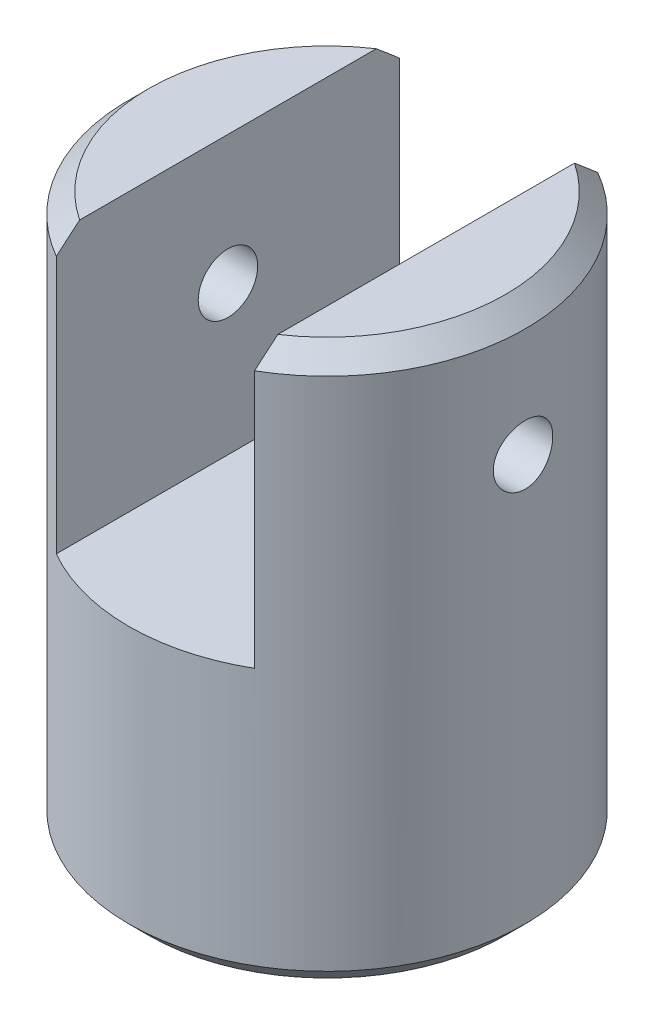
ISO-10303-21;
HEADER;
FILE_DESCRIPTION(('STEP AP214'),'2;1');
FILE_NAME('part.step','',(''),(''),'','','');
FILE_SCHEMA(('AUTOMOTIVE_DESIGN { 1 0 10303 214 1 1 1 1 }'));
ENDSEC;
DATA;
#1=APPLICATION_CONTEXT('core data for automotive mechanical design processes');
#2=APPLICATION_PROTOCOL_DEFINITION('international standard','automotive_design',2000,#1);
#3=PRODUCT_CONTEXT('',#1,'mechanical');
#4=PRODUCT('Part','Part','',(#3));
#5=PRODUCT_RELATED_PRODUCT_CATEGORY('part','',(#4));
#6=PRODUCT_DEFINITION_FORMATION('','',#4);
#7=PRODUCT_DEFINITION_CONTEXT('part definition',#1,'design');
#8=PRODUCT_DEFINITION('design','',#6,#7);
#9=PRODUCT_DEFINITION_SHAPE('','',#8);
#10=(LENGTH_UNIT() NAMED_UNIT(*) SI_UNIT(.MILLI.,.METRE.));
#11=(NAMED_UNIT(*) PLANE_ANGLE_UNIT() SI_UNIT($,.RADIAN.));
#12=(NAMED_UNIT(*) SI_UNIT($,.STERADIAN.) SOLID_ANGLE_UNIT());
#13=UNCERTAINTY_MEASURE_WITH_UNIT(LENGTH_MEASURE(1.E-05),#10,'distance_accuracy_value','');
#14=(GEOMETRIC_REPRESENTATION_CONTEXT(3) GLOBAL_UNCERTAINTY_ASSIGNED_CONTEXT((#13)) GLOBAL_UNIT_ASSIGNED_CONTEXT((#10,
#11,#12)) REPRESENTATION_CONTEXT('',''));
#15=CARTESIAN_POINT('',(0.,0.,0.));
#16=DIRECTION('',(0.,0.,1.));
#17=DIRECTION('',(1.,0.,0.));
#18=AXIS2_PLACEMENT_3D('',#15,#16,#17);
#19=CARTESIAN_POINT('',(0.,14.,0.));
#20=DIRECTION('',(0.,-1.,0.));
#21=DIRECTION('',(0.,0.,-1.));
#22=AXIS2_PLACEMENT_3D('',#19,#20,#21);
#23=CYLINDRICAL_SURFACE('',#22,5.);
#24=CARTESIAN_POINT('',(-4.9434299833213,10.75,-0.750000000000001));
#25=CARTESIAN_POINT('',(-4.94343068334296,10.708127215355,-0.749998270536421));
#26=CARTESIAN_POINT('',(-4.9439677586955,10.6662301246246,-0.746481481942455));
#27=CARTESIAN_POINT('',(-4.9460565740162,10.5836073425584,-0.732510983285004));
#28=CARTESIAN_POINT('',(-4.94760930365715,10.54288283426,-0.722050507013141));
#29=CARTESIAN_POINT('',(-4.95154969493114,10.4638131222765,-0.69451263049042));
#30=CARTESIAN_POINT('',(-4.95393671565768,10.4254661187289,-0.677440308406985));
#31=CARTESIAN_POINT('',(-4.95927597056573,10.352186484614,-0.637175315438957));
#32=CARTESIAN_POINT('',(-4.96222812691834,10.3172533848929,-0.61398348714936));
#33=CARTESIAN_POINT('',(-4.9683914462402,10.2515080916228,-0.561939512092793));
#34=CARTESIAN_POINT('',(-4.97160431229029,10.2207271932966,-0.533048027924102));
#35=CARTESIAN_POINT('',(-4.97791184084524,10.1644312571723,-0.470509802722188));
#36=CARTESIAN_POINT('',(-4.98100649684307,10.1389165089165,-0.436862800393266));
#37=CARTESIAN_POINT('',(-4.98674673714093,10.0937616841543,-0.365568179026373));
#38=CARTESIAN_POINT('',(-4.98939009217784,10.0741504248388,-0.327902113682884));
#39=CARTESIAN_POINT('',(-4.99391103373202,10.0415442005959,-0.249764425053488));
#40=CARTESIAN_POINT('',(-4.99578866070972,10.0285488860786,-0.209292950135339));
#41=CARTESIAN_POINT('',(-4.99855457398891,10.0096383057346,-0.127015561545285));
#42=CARTESIAN_POINT('',(-4.99945017943672,10.0036706368064,-0.0852219421949333));
#43=CARTESIAN_POINT('',(-5.00017622384792,9.99882203258755,-0.00121760200973985));
#44=CARTESIAN_POINT('',(-5.0000067220247,9.99994070334016,0.0409930955078728));
#45=CARTESIAN_POINT('',(-4.99862749830398,10.0091916688812,0.124275859100259));
#46=CARTESIAN_POINT('',(-4.99742613826239,10.0172675858957,0.165354345700003));
#47=CARTESIAN_POINT('',(-4.99412750113925,10.0401153031613,0.245566414571568));
#48=CARTESIAN_POINT('',(-4.99203020099869,10.0548872757507,0.28469994675674));
#49=CARTESIAN_POINT('',(-4.98716096936603,10.0907654984585,0.360081890385158));
#50=CARTESIAN_POINT('',(-4.98438651757819,10.1118954825544,0.396318836161798));
#51=CARTESIAN_POINT('',(-4.97847219122711,10.159872596835,0.464753953575088));
#52=CARTESIAN_POINT('',(-4.97533229261592,10.1867201033534,0.496951859135867));
#53=CARTESIAN_POINT('',(-4.96900079096313,10.2456842244133,0.556727241361322));
#54=CARTESIAN_POINT('',(-4.96580898311628,10.2778500609851,0.584256164754733));
#55=CARTESIAN_POINT('',(-4.95976352226762,10.3463705385619,0.633532996694064));
#56=CARTESIAN_POINT('',(-4.95690987134824,10.38272520536,0.655280869639994));
#57=CARTESIAN_POINT('',(-4.95186387643428,10.4586419814703,0.692384822673024));
#58=CARTESIAN_POINT('',(-4.94967204922646,10.4982065668312,0.707735911350408));
#59=CARTESIAN_POINT('',(-4.9462070144953,10.5793926275737,0.731561681044396));
#60=CARTESIAN_POINT('',(-4.9449337422315,10.6210139577734,0.74003684668663));
#61=CARTESIAN_POINT('',(-4.94346225697513,10.7047000447887,0.749803600433278));
#62=CARTESIAN_POINT('',(-4.94325374401287,10.7467565941008,0.751164016325262));
#63=CARTESIAN_POINT('',(-4.94390803968577,10.8304970974087,0.746845285099096));
#64=CARTESIAN_POINT('',(-4.94477081507889,10.8721810629254,0.741166356411512));
#65=CARTESIAN_POINT('',(-4.94746101230727,10.9537799089828,0.722988514763831));
#66=CARTESIAN_POINT('',(-4.94928358241429,10.9937026024708,0.710523892639104));
#67=CARTESIAN_POINT('',(-4.95368400912884,11.0708920460243,0.679164159735433));
#68=CARTESIAN_POINT('',(-4.95626190303588,11.1081586648141,0.660268731381946));
#69=CARTESIAN_POINT('',(-4.96190677843531,11.1792866301675,0.616418389976619));
#70=CARTESIAN_POINT('',(-4.96497729639994,11.2131202236399,0.591418922808832));
#71=CARTESIAN_POINT('',(-4.97125079716678,11.2761364299369,0.536132084186008));
#72=CARTESIAN_POINT('',(-4.97445378745146,11.3053187795906,0.505844413723399));
#73=CARTESIAN_POINT('',(-4.98066352608693,11.3584513033168,0.440537809814093));
#74=CARTESIAN_POINT('',(-4.98366841730212,11.3823558641212,0.40548156338598));
#75=CARTESIAN_POINT('',(-4.98911452516008,11.4239364526313,0.331811040131841));
#76=CARTESIAN_POINT('',(-4.99155575722282,11.4416126507325,0.29319686068022));
#77=CARTESIAN_POINT('',(-4.99559134830398,11.470161871244,0.213648997930574));
#78=CARTESIAN_POINT('',(-4.9971888085895,11.4810598335392,0.172724429377152));
#79=CARTESIAN_POINT('',(-4.99936988328448,11.4958239397687,0.0896004077505968));
#80=CARTESIAN_POINT('',(-4.99995356465401,11.4996905481246,0.0474010390652906));
#81=CARTESIAN_POINT('',(-5.00004064529571,11.5002708522747,-0.0366322954304091));
#82=CARTESIAN_POINT('',(-4.99955458511898,11.4970543404385,-0.0784657851060259));
#83=CARTESIAN_POINT('',(-4.99757805259571,11.4837093057896,-0.160989897661553));
#84=CARTESIAN_POINT('',(-4.99608758346333,11.4735808050957,-0.201680524198256));
#85=CARTESIAN_POINT('',(-4.99226893371232,11.4467240622149,-0.28074468718983));
#86=CARTESIAN_POINT('',(-4.98994136658473,11.4300006524305,-0.319119896574391));
#87=CARTESIAN_POINT('',(-4.9847041724775,11.3904362560084,-0.392530558948301));
#88=CARTESIAN_POINT('',(-4.98179452660169,11.3675950707598,-0.427565903460355));
#89=CARTESIAN_POINT('',(-4.97568255318089,11.3161911505854,-0.493656292595979));
#90=CARTESIAN_POINT('',(-4.97247774212971,11.2875768870918,-0.524671033223191));
#91=CARTESIAN_POINT('',(-4.96615500844501,11.2255474634598,-0.581484041951338));
#92=CARTESIAN_POINT('',(-4.96303710638146,11.1921311780878,-0.607281083994919));
#93=CARTESIAN_POINT('',(-4.95722242014558,11.1212255083837,-0.653056554114872));
#94=CARTESIAN_POINT('',(-4.95452810078493,11.0837142914891,-0.673001471456045));
#95=CARTESIAN_POINT('',(-4.94989454555362,11.0058516116184,-0.706278069360226));
#96=CARTESIAN_POINT('',(-4.94795452653966,10.9655031460711,-0.719616612874488));
#97=CARTESIAN_POINT('',(-4.94549742762413,10.8958112818718,-0.736274759450132));
#98=CARTESIAN_POINT('',(-4.9447262469119,10.8668983015379,-0.741413848902101));
#99=CARTESIAN_POINT('',(-4.94369228283506,10.8086608541328,-0.748277052882871));
#100=CARTESIAN_POINT('',(-4.94342949288078,10.7793363924002,-0.750001211675379));
#101=CARTESIAN_POINT('',(-4.9434299833213,10.75,-0.750000000000001));
#102=B_SPLINE_CURVE_WITH_KNOTS('',3,(#24,#25,#26,#27,#28,#29,#30,#31,#32,#33,#34,#35,#36,#37,
#38,#39,#40,#41,#42,#43,#44,#45,#46,#47,#48,#49,#50,#51,#52,#53,#54,#55,#56,#57,#58,#59,#60,#61,
#62,#63,#64,#65,#66,#67,#68,#69,#70,#71,#72,#73,#74,#75,#76,#77,#78,#79,#80,#81,#82,#83,#84,#85,
#86,#87,#88,#89,#90,#91,#92,#93,#94,#95,#96,#97,#98,#99,#100,#101),.UNSPECIFIED.,.T.,.F.,(4,2,2,
2,2,2,2,2,2,2,2,2,2,2,2,2,2,2,2,2,2,2,2,2,2,2,2,2,2,2,2,2,2,2,2,2,2,2,4),(0.,0.125511125902433,
0.2511447347809,0.376682042667836,0.502202074330662,0.628620793245537,0.755046461039085,
0.88207961052891,1.0091060468225,1.13517916267198,1.26124526969687,1.38629931257864,
1.51135657419701,1.63688658193227,1.76242485474636,1.88919772333135,2.01597137257175,
2.14284375886569,2.26970720222171,2.39534107301872,2.52097104549959,2.64597197403687,
2.77097907643058,2.89692743000651,3.02288290730901,3.14988768876758,3.27688899535927,
3.40342020445545,3.52994305585237,3.65522481811163,3.78050617946411,3.90569591128917,
4.03088970783553,4.15725475005485,4.28364945118431,4.41075439412466,4.53772701722782,
4.62566220945807,4.71359626188096),.UNSPECIFIED.);
#103=CARTESIAN_POINT('',(-4.9434299833213,10.75,-0.750000000000001));
#104=VERTEX_POINT('',#103);
#105=EDGE_CURVE('E203',#104,#104,#102,.T.);
#106=ORIENTED_EDGE('',*,*,#105,.F.);
#107=EDGE_LOOP('',(#106));
#108=FACE_BOUND('',#107,.T.);
#109=CARTESIAN_POINT('',(0.,0.499999999999999,0.));
#110=DIRECTION('',(0.,1.,0.));
#111=DIRECTION('',(0.,0.,1.));
#112=AXIS2_PLACEMENT_3D('',#109,#110,#111);
#113=CIRCLE('',#112,5.);
#114=CARTESIAN_POINT('',(0.,0.499999999999999,5.));
#115=VERTEX_POINT('',#114);
#116=EDGE_CURVE('E114',#115,#115,#113,.T.);
#117=ORIENTED_EDGE('',*,*,#116,.T.);
#118=EDGE_LOOP('',(#117));
#119=FACE_BOUND('',#118,.T.);
#120=CARTESIAN_POINT('',(0.,13.5,0.));
#121=DIRECTION('',(0.,1.,0.));
#122=DIRECTION('',(0.,0.,1.));
#123=AXIS2_PLACEMENT_3D('',#120,#121,#122);
#124=CIRCLE('',#123,5.);
#125=CARTESIAN_POINT('',(2.5,13.5,-4.33012701892219));
#126=VERTEX_POINT('',#125);
#127=CARTESIAN_POINT('',(2.5,13.4999999999999,4.33012701892231));
#128=VERTEX_POINT('',#127);
#129=EDGE_CURVE('E161',#126,#128,#124,.F.);
#130=ORIENTED_EDGE('',*,*,#129,.T.);
#131=DIRECTION('',(0.,-1.,0.));
#132=VECTOR('',#131,1.);
#133=CARTESIAN_POINT('',(2.5,14.,4.33012701892219));
#134=LINE('',#133,#132);
#135=CARTESIAN_POINT('',(2.5,7.,4.33012701892219));
#136=VERTEX_POINT('',#135);
#137=EDGE_CURVE('E63',#128,#136,#134,.T.);
#138=ORIENTED_EDGE('',*,*,#137,.T.);
#139=CARTESIAN_POINT('',(0.,7.,0.));
#140=DIRECTION('',(0.,-1.,0.));
#141=DIRECTION('',(0.,0.,-1.));
#142=AXIS2_PLACEMENT_3D('',#139,#140,#141);
#143=CIRCLE('',#142,5.);
#144=CARTESIAN_POINT('',(-2.5,7.,4.3301270189222));
#145=VERTEX_POINT('',#144);
#146=EDGE_CURVE('E176',#136,#145,#143,.T.);
#147=ORIENTED_EDGE('',*,*,#146,.T.);
#148=DIRECTION('',(0.,-1.,0.));
#149=VECTOR('',#148,1.);
#150=CARTESIAN_POINT('',(-2.5,14.,4.3301270189222));
#151=LINE('',#150,#149);
#152=CARTESIAN_POINT('',(-2.5,13.5,4.3301270189222));
#153=VERTEX_POINT('',#152);
#154=EDGE_CURVE('E173',#145,#153,#151,.F.);
#155=ORIENTED_EDGE('',*,*,#154,.T.);
#156=CARTESIAN_POINT('',(-2.5,13.4999999999999,-4.33012701892231));
#157=VERTEX_POINT('',#156);
#158=EDGE_CURVE('E160',#153,#157,#124,.F.);
#159=ORIENTED_EDGE('',*,*,#158,.T.);
#160=DIRECTION('',(0.,-1.,0.));
#161=VECTOR('',#160,1.);
#162=CARTESIAN_POINT('',(-2.5,14.,-4.33012701892219));
#163=LINE('',#162,#161);
#164=CARTESIAN_POINT('',(-2.5,7.,-4.33012701892219));
#165=VERTEX_POINT('',#164);
#166=EDGE_CURVE('E96',#157,#165,#163,.T.);
#167=ORIENTED_EDGE('',*,*,#166,.T.);
#168=CARTESIAN_POINT('',(2.5,7.,-4.33012701892219));
#169=VERTEX_POINT('',#168);
#170=EDGE_CURVE('E120',#165,#169,#143,.T.);
#171=ORIENTED_EDGE('',*,*,#170,.T.);
#172=DIRECTION('',(0.,-1.,0.));
#173=VECTOR('',#172,1.);
#174=CARTESIAN_POINT('',(2.5,14.,-4.33012701892219));
#175=LINE('',#174,#173);
#176=EDGE_CURVE('E169',#169,#126,#175,.F.);
#177=ORIENTED_EDGE('',*,*,#176,.T.);
#178=EDGE_LOOP('',(#130,#138,#147,#155,#159,#167,#171,#177));
#179=FACE_BOUND('',#178,.T.);
#180=CARTESIAN_POINT('',(4.9434299833213,10.75,0.75));
#181=CARTESIAN_POINT('',(4.94343068334296,10.791872784645,0.749998270536421));
#182=CARTESIAN_POINT('',(4.9439677586955,10.8337698753754,0.746481481942454));
#183=CARTESIAN_POINT('',(4.9460565740162,10.9163926574416,0.732510983285004));
#184=CARTESIAN_POINT('',(4.94760930365715,10.95711716574,0.722050507013141));
#185=CARTESIAN_POINT('',(4.95154969493114,11.0361868777235,0.69451263049042));
#186=CARTESIAN_POINT('',(4.95393671565768,11.0745338812711,0.677440308406985));
#187=CARTESIAN_POINT('',(4.95927597056573,11.147813515386,0.637175315438957));
#188=CARTESIAN_POINT('',(4.96222812691834,11.1827466151071,0.613983487149359));
#189=CARTESIAN_POINT('',(4.9683914462402,11.2484919083772,0.561939512092793));
#190=CARTESIAN_POINT('',(4.97160431229029,11.2792728067034,0.533048027924102));
#191=CARTESIAN_POINT('',(4.97791184084524,11.3355687428278,0.470509802722188));
#192=CARTESIAN_POINT('',(4.98100649684307,11.3610834910835,0.436862800393266));
#193=CARTESIAN_POINT('',(4.98674673714093,11.4062383158457,0.365568179026373));
#194=CARTESIAN_POINT('',(4.98939009217784,11.4258495751612,0.327902113682884));
#195=CARTESIAN_POINT('',(4.99391103373202,11.4584557994041,0.249764425053488));
#196=CARTESIAN_POINT('',(4.99578866070972,11.4714511139214,0.209292950135339));
#197=CARTESIAN_POINT('',(4.99855457398891,11.4903616942654,0.127015561545285));
#198=CARTESIAN_POINT('',(4.99945017943672,11.4963293631936,0.0852219421949331));
#199=CARTESIAN_POINT('',(5.00017622384792,11.5011779674124,0.00121760200973962));
#200=CARTESIAN_POINT('',(5.0000067220247,11.5000592966598,-0.040993095507873));
#201=CARTESIAN_POINT('',(4.99862749830398,11.4908083311188,-0.12427585910026));
#202=CARTESIAN_POINT('',(4.99742613826239,11.4827324141043,-0.165354345700004));
#203=CARTESIAN_POINT('',(4.99412750113925,11.4598846968387,-0.245566414571568));
#204=CARTESIAN_POINT('',(4.99203020099869,11.4451127242493,-0.28469994675674));
#205=CARTESIAN_POINT('',(4.98716096936603,11.4092345015415,-0.360081890385158));
#206=CARTESIAN_POINT('',(4.98438651757819,11.3881045174456,-0.396318836161798));
#207=CARTESIAN_POINT('',(4.97847219122711,11.340127403165,-0.464753953575088));
#208=CARTESIAN_POINT('',(4.97533229261592,11.3132798966466,-0.496951859135867));
#209=CARTESIAN_POINT('',(4.96900079096313,11.2543157755867,-0.556727241361323));
#210=CARTESIAN_POINT('',(4.96580898311628,11.2221499390149,-0.584256164754733));
#211=CARTESIAN_POINT('',(4.95976352226762,11.1536294614381,-0.633532996694064));
#212=CARTESIAN_POINT('',(4.95690987134824,11.11727479464,-0.655280869639995));
#213=CARTESIAN_POINT('',(4.95186387643428,11.0413580185297,-0.692384822673024));
#214=CARTESIAN_POINT('',(4.94967204922646,11.0017934331688,-0.707735911350408));
#215=CARTESIAN_POINT('',(4.9462070144953,10.9206073724263,-0.731561681044396));
#216=CARTESIAN_POINT('',(4.9449337422315,10.8789860422266,-0.74003684668663));
#217=CARTESIAN_POINT('',(4.94346225697513,10.7952999552113,-0.749803600433278));
#218=CARTESIAN_POINT('',(4.94325374401287,10.7532434058992,-0.751164016325262));
#219=CARTESIAN_POINT('',(4.94390803968577,10.6695029025913,-0.746845285099096));
#220=CARTESIAN_POINT('',(4.94477081507889,10.6278189370746,-0.741166356411512));
#221=CARTESIAN_POINT('',(4.94746101230727,10.5462200910172,-0.722988514763831));
#222=CARTESIAN_POINT('',(4.94928358241429,10.5062973975292,-0.710523892639104));
#223=CARTESIAN_POINT('',(4.95368400912884,10.4291079539757,-0.679164159735434));
#224=CARTESIAN_POINT('',(4.95626190303588,10.3918413351859,-0.660268731381946));
#225=CARTESIAN_POINT('',(4.96190677843531,10.3207133698325,-0.616418389976619));
#226=CARTESIAN_POINT('',(4.96497729639994,10.2868797763601,-0.591418922808832));
#227=CARTESIAN_POINT('',(4.97125079716678,10.2238635700631,-0.536132084186009));
#228=CARTESIAN_POINT('',(4.97445378745146,10.1946812204094,-0.505844413723399));
#229=CARTESIAN_POINT('',(4.98066352608693,10.1415486966832,-0.440537809814094));
#230=CARTESIAN_POINT('',(4.98366841730212,10.1176441358788,-0.40548156338598));
#231=CARTESIAN_POINT('',(4.98911452516008,10.0760635473687,-0.331811040131842));
#232=CARTESIAN_POINT('',(4.99155575722282,10.0583873492675,-0.293196860680221));
#233=CARTESIAN_POINT('',(4.99559134830398,10.029838128756,-0.213648997930575));
#234=CARTESIAN_POINT('',(4.9971888085895,10.0189401664608,-0.172724429377152));
#235=CARTESIAN_POINT('',(4.99936988328448,10.0041760602313,-0.0896004077505977));
#236=CARTESIAN_POINT('',(4.99995356465401,10.0003094518754,-0.0474010390652915));
#237=CARTESIAN_POINT('',(5.00004064529571,9.9997291477253,0.0366322954304083));
#238=CARTESIAN_POINT('',(4.99955458511898,10.0029456595615,0.0784657851060251));
#239=CARTESIAN_POINT('',(4.99757805259571,10.0162906942104,0.160989897661553));
#240=CARTESIAN_POINT('',(4.99608758346333,10.0264191949043,0.201680524198256));
#241=CARTESIAN_POINT('',(4.99226893371232,10.0532759377851,0.28074468718983));
#242=CARTESIAN_POINT('',(4.98994136658473,10.0699993475695,0.319119896574391));
#243=CARTESIAN_POINT('',(4.9847041724775,10.1095637439916,0.392530558948301));
#244=CARTESIAN_POINT('',(4.98179452660169,10.1324049292402,0.427565903460354));
#245=CARTESIAN_POINT('',(4.97568255318089,10.1838088494146,0.493656292595979));
#246=CARTESIAN_POINT('',(4.97247774212971,10.2124231129082,0.524671033223191));
#247=CARTESIAN_POINT('',(4.96615500844501,10.2744525365402,0.581484041951339));
#248=CARTESIAN_POINT('',(4.96303710638146,10.3078688219122,0.607281083994919));
#249=CARTESIAN_POINT('',(4.95722242014558,10.3787744916163,0.653056554114872));
#250=CARTESIAN_POINT('',(4.95452810078493,10.4162857085109,0.673001471456045));
#251=CARTESIAN_POINT('',(4.94989454555362,10.4941483883817,0.706278069360226));
#252=CARTESIAN_POINT('',(4.94795452653966,10.5344968539289,0.719616612874488));
#253=CARTESIAN_POINT('',(4.94549742762413,10.6041887181282,0.736274759450132));
#254=CARTESIAN_POINT('',(4.9447262469119,10.6331016984621,0.741413848902101));
#255=CARTESIAN_POINT('',(4.94369228283506,10.6913391458672,0.748277052882871));
#256=CARTESIAN_POINT('',(4.94342949288078,10.7206636075998,0.750001211675379));
#257=CARTESIAN_POINT('',(4.9434299833213,10.75,0.75));
#258=B_SPLINE_CURVE_WITH_KNOTS('',3,(#180,#181,#182,#183,#184,#185,#186,#187,#188,#189,#190,
#191,#192,#193,#194,#195,#196,#197,#198,#199,#200,#201,#202,#203,#204,#205,#206,#207,#208,#209,
#210,#211,#212,#213,#214,#215,#216,#217,#218,#219,#220,#221,#222,#223,#224,#225,#226,#227,#228,
#229,#230,#231,#232,#233,#234,#235,#236,#237,#238,#239,#240,#241,#242,#243,#244,#245,#246,#247,
#248,#249,#250,#251,#252,#253,#254,#255,#256,#257),.UNSPECIFIED.,.T.,.F.,(4,2,2,2,2,2,2,2,2,2,2,
2,2,2,2,2,2,2,2,2,2,2,2,2,2,2,2,2,2,2,2,2,2,2,2,2,2,2,4),(0.,0.125511125902433,0.2511447347809,
0.376682042667836,0.502202074330662,0.628620793245537,0.755046461039085,0.88207961052891,
1.0091060468225,1.13517916267198,1.26124526969687,1.38629931257864,1.51135657419701,
1.63688658193227,1.76242485474636,1.88919772333135,2.01597137257175,2.14284375886569,
2.26970720222171,2.39534107301872,2.52097104549959,2.64597197403687,2.77097907643058,
2.89692743000651,3.02288290730901,3.14988768876758,3.27688899535927,3.40342020445545,
3.52994305585237,3.65522481811163,3.78050617946412,3.90569591128917,4.03088970783553,
4.15725475005485,4.28364945118431,4.41075439412466,4.53772701722782,4.62566220945807,
4.71359626188096),.UNSPECIFIED.);
#259=CARTESIAN_POINT('',(4.9434299833213,10.75,0.75));
#260=VERTEX_POINT('',#259);
#261=EDGE_CURVE('E107',#260,#260,#258,.T.);
#262=ORIENTED_EDGE('',*,*,#261,.T.);
#263=EDGE_LOOP('',(#262));
#264=FACE_BOUND('',#263,.T.);
#265=ADVANCED_FACE('F35',(#108,#119,#179,#264),#23,.T.);
#266=CARTESIAN_POINT('',(2.5,7.,-5.));
#267=DIRECTION('',(1.,0.,0.));
#268=DIRECTION('',(0.,0.,-1.));
#269=AXIS2_PLACEMENT_3D('',#266,#267,#268);
#270=PLANE('',#269);
#271=CARTESIAN_POINT('',(2.5,7.49230468164976,10.7200445997966));
#272=CARTESIAN_POINT('',(2.5,7.75506756636977,10.4502132832323));
#273=CARTESIAN_POINT('',(2.5,8.01758510829374,10.1801421958178));
#274=CARTESIAN_POINT('',(2.5,8.54196313580733,9.63934488119114));
#275=CARTESIAN_POINT('',(2.5,8.80382359832416,9.36861863161152));
#276=CARTESIAN_POINT('',(2.5,9.32732256665294,8.82571139176574));
#277=CARTESIAN_POINT('',(2.5,9.5889590751083,8.55352847435077));
#278=CARTESIAN_POINT('',(2.5,10.1111100876743,8.00810209070006));
#279=CARTESIAN_POINT('',(2.5,10.3716246226112,7.73485865399944));
#280=CARTESIAN_POINT('',(2.5,10.9274271051678,7.1486869879645));
#281=CARTESIAN_POINT('',(2.5,11.2224905136658,6.83554566200725));
#282=CARTESIAN_POINT('',(2.5,11.8098036619689,6.20657096159051));
#283=CARTESIAN_POINT('',(2.5,12.1020531394998,5.89073734126856));
#284=CARTESIAN_POINT('',(2.5,12.5368245533138,5.41420501609597));
#285=CARTESIAN_POINT('',(2.5,12.6810236006092,5.25503739000377));
#286=CARTESIAN_POINT('',(2.5,12.9679780699096,4.93540730469388));
#287=CARTESIAN_POINT('',(2.5,13.1107335095992,4.77494486138156));
#288=CARTESIAN_POINT('',(2.5,13.3943352959092,4.45238307130351));
#289=CARTESIAN_POINT('',(2.5,13.5351819344881,4.29028398164157));
#290=CARTESIAN_POINT('',(2.5,13.8143346592327,3.96391676555558));
#291=CARTESIAN_POINT('',(2.5,13.9526408687089,3.79964874507863));
#292=CARTESIAN_POINT('',(2.5,14.1765463438924,3.52786693839434));
#293=CARTESIAN_POINT('',(2.5,14.2631917184952,3.42121588972721));
#294=CARTESIAN_POINT('',(2.5,14.434650967256,3.20643950812956));
#295=CARTESIAN_POINT('',(2.5,14.5194647583396,3.09831410868889));
#296=CARTESIAN_POINT('',(2.5,14.6869907632852,2.87992439432935));
#297=CARTESIAN_POINT('',(2.5,14.7696958944985,2.76965462746721));
#298=CARTESIAN_POINT('',(2.5,14.9319982014881,2.54685447802807));
#299=CARTESIAN_POINT('',(2.5,15.0115956601429,2.43432430262538));
#300=CARTESIAN_POINT('',(2.5,15.1645871568412,2.2094333924181));
#301=CARTESIAN_POINT('',(2.5,15.2380895732178,2.0971468571604));
#302=CARTESIAN_POINT('',(2.5,15.3797803212791,1.86915932082887));
#303=CARTESIAN_POINT('',(2.5,15.4479661145626,1.75345672467647));
#304=CARTESIAN_POINT('',(2.5,15.5766027847052,1.51851163818868));
#305=CARTESIAN_POINT('',(2.5,15.637089613119,1.39928906505602));
#306=CARTESIAN_POINT('',(2.5,15.7477122322526,1.15618552956646));
#307=CARTESIAN_POINT('',(2.5,15.7978619346617,1.03231109679894));
#308=CARTESIAN_POINT('',(2.5,15.8657113940024,0.833161623232762));
#309=CARTESIAN_POINT('',(2.5,15.888161956003,0.75950663533327));
#310=CARTESIAN_POINT('',(2.5,15.9274941305695,0.610683795946784));
#311=CARTESIAN_POINT('',(2.5,15.9443745255628,0.535515617499099));
#312=CARTESIAN_POINT('',(2.5,15.9717167247348,0.384336717463551));
#313=CARTESIAN_POINT('',(2.5,15.9822056590697,0.308330971298985));
#314=CARTESIAN_POINT('',(2.5,15.9963092567708,0.155686756839111));
#315=CARTESIAN_POINT('',(2.5,15.9999251105075,0.0790484004172064));
#316=CARTESIAN_POINT('',(2.5,16.0000728245547,-0.0744968895515405));
#317=CARTESIAN_POINT('',(2.5,15.99658048878,-0.151403847872895));
#318=CARTESIAN_POINT('',(2.5,15.9826702329363,-0.304582243916141));
#319=CARTESIAN_POINT('',(2.5,15.972251909262,-0.38085364433922));
#320=CARTESIAN_POINT('',(2.5,15.9450010489905,-0.532556249007512));
#321=CARTESIAN_POINT('',(2.5,15.9281417728176,-0.607982582825233));
#322=CARTESIAN_POINT('',(2.5,15.8887997060919,-0.757336293494587));
#323=CARTESIAN_POINT('',(2.5,15.8663164424582,-0.831263543679831));
#324=CARTESIAN_POINT('',(2.5,15.7874453384756,-1.06314705148186));
#325=CARTESIAN_POINT('',(2.5,15.7221939550254,-1.21808765790563));
#326=CARTESIAN_POINT('',(2.5,15.5767773878069,-1.52084061094836));
#327=CARTESIAN_POINT('',(2.5,15.4965833852095,-1.66863847619157));
#328=CARTESIAN_POINT('',(2.5,15.3686614858512,-1.88645685019238));
#329=CARTESIAN_POINT('',(2.5,15.324581172047,-1.95866246406654));
#330=CARTESIAN_POINT('',(2.5,15.2343633229119,-2.10178037140046));
#331=CARTESIAN_POINT('',(2.5,15.1882257419775,-2.17269263614136));
#332=CARTESIAN_POINT('',(2.5,15.0943114761419,-2.31331965029671));
#333=CARTESIAN_POINT('',(2.5,15.0465364113601,-2.38303548646622));
#334=CARTESIAN_POINT('',(2.5,14.9495871644524,-2.52148130605297));
#335=CARTESIAN_POINT('',(2.5,14.9004130325294,-2.59021132471161));
#336=CARTESIAN_POINT('',(2.5,14.7418086022003,-2.80794039877899));
#337=CARTESIAN_POINT('',(2.5,14.6301717804063,-2.95533231754791));
#338=CARTESIAN_POINT('',(2.5,14.4030119535972,-3.2470995775914));
#339=CARTESIAN_POINT('',(2.5,14.2874883395453,-3.39147444031171));
#340=CARTESIAN_POINT('',(2.5,14.0535706726081,-3.67798515912078));
#341=CARTESIAN_POINT('',(2.5,13.9351753161494,-3.82011994817957));
#342=CARTESIAN_POINT('',(2.5,13.6962779413685,-4.10261115079802));
#343=CARTESIAN_POINT('',(2.5,13.5757758471217,-4.24296749994891));
#344=CARTESIAN_POINT('',(2.5,13.3329591472947,-4.52251191771861));
#345=CARTESIAN_POINT('',(2.5,13.2106418550402,-4.66169764868645));
#346=CARTESIAN_POINT('',(2.5,12.9647399289612,-4.93894605483598));
#347=CARTESIAN_POINT('',(2.5,12.8411552809227,-5.07700871739071));
#348=CARTESIAN_POINT('',(2.5,12.4689754027014,-5.48976339446039));
#349=CARTESIAN_POINT('',(2.5,12.2188823489959,-5.76310419169612));
#350=CARTESIAN_POINT('',(2.5,11.7167631897699,-6.30658337970288));
#351=CARTESIAN_POINT('',(2.5,11.464744423164,-6.57672857694711));
#352=CARTESIAN_POINT('',(2.5,10.9588450798599,-7.11530352125393));
#353=CARTESIAN_POINT('',(2.5,10.7049643759338,-7.38373314869975));
#354=CARTESIAN_POINT('',(2.5,10.1960642778904,-7.91910575256703));
#355=CARTESIAN_POINT('',(2.5,9.94104594180954,-8.18604973593262));
#356=CARTESIAN_POINT('',(2.5,9.43000485919243,-8.71897466100184));
#357=CARTESIAN_POINT('',(2.5,9.17398211144013,-8.98495560153878));
#358=CARTESIAN_POINT('',(2.5,8.79910159811315,-9.37328370316923));
#359=CARTESIAN_POINT('',(2.5,8.68054798765262,-9.49592474663264));
#360=CARTESIAN_POINT('',(2.5,8.44327874422361,-9.74107771699721));
#361=CARTESIAN_POINT('',(2.5,8.32456309397788,-9.86358962717925));
#362=CARTESIAN_POINT('',(2.5,8.08698533845364,-10.1084993459394));
#363=CARTESIAN_POINT('',(2.5,7.96812321757388,-10.2308971393808));
#364=CARTESIAN_POINT('',(2.5,7.73029338471663,-10.475562124604));
#365=CARTESIAN_POINT('',(2.5,7.61132568679086,-10.5978293300444));
#366=CARTESIAN_POINT('',(2.5,7.49230468164976,-10.7200445997966));
#367=B_SPLINE_CURVE_WITH_KNOTS('',3,(#271,#272,#273,#274,#275,#276,#277,#278,#279,#280,#281,
#282,#283,#284,#285,#286,#287,#288,#289,#290,#291,#292,#293,#294,#295,#296,#297,#298,#299,#300,
#301,#302,#303,#304,#305,#306,#307,#308,#309,#310,#311,#312,#313,#314,#315,#316,#317,#318,#319,
#320,#321,#322,#323,#324,#325,#326,#327,#328,#329,#330,#331,#332,#333,#334,#335,#336,#337,#338,
#339,#340,#341,#342,#343,#344,#345,#346,#347,#348,#349,#350,#351,#352,#353,#354,#355,#356,#357,
#358,#359,#360,#361,#362,#363,#364,#365,#366),.UNSPECIFIED.,.F.,.F.,(4,2,2,2,2,2,2,2,2,2,2,2,2,
2,2,2,2,2,2,2,2,2,2,2,2,2,2,2,2,2,2,2,2,2,2,2,2,2,2,2,2,2,2,2,2,2,2,4),(0.,1.129903177141,
2.2598454896959,3.39246613245,4.52505545523974,5.8158126607009,7.10668902956722,
7.75100347520628,8.39531001817709,9.0395168736972,9.68369237681629,10.0959110309072,
10.5081483427213,10.9216246705417,11.3350632731853,11.7375696522995,12.1402670445238,
12.5410090138358,12.9412080923069,13.1720313762002,13.4029050819565,13.6327918327882,
13.86263876518,14.0932693987257,14.3239134732292,14.5555256571908,14.7871573305593,
15.2901376383655,15.7940982443734,16.0478616380057,16.3016306596197,16.5551554667907,
16.8086711881526,17.3632568495349,17.9179298196026,18.4728594677621,19.0278091563874,
19.5836839775548,20.1395650399658,21.2509998382779,22.359334083863,23.467744782086,
24.5752798183885,25.6828161959835,26.1945407059112,26.7063248724215,27.2181693109022,
27.7299535934082),.UNSPECIFIED.);
#368=CARTESIAN_POINT('',(2.5,14.,3.74165738677394));
#369=VERTEX_POINT('',#368);
#370=EDGE_CURVE('E11',#128,#369,#367,.T.);
#371=ORIENTED_EDGE('',*,*,#370,.T.);
#372=DIRECTION('',(0.,0.,-1.));
#373=VECTOR('',#372,1.);
#374=CARTESIAN_POINT('',(2.5,14.,-5.));
#375=LINE('',#374,#373);
#376=CARTESIAN_POINT('',(2.5,14.,-3.74165738677394));
#377=VERTEX_POINT('',#376);
#378=EDGE_CURVE('E106',#369,#377,#375,.T.);
#379=ORIENTED_EDGE('',*,*,#378,.T.);
#380=EDGE_CURVE('E40',#377,#126,#367,.T.);
#381=ORIENTED_EDGE('',*,*,#380,.T.);
#382=ORIENTED_EDGE('',*,*,#176,.F.);
#383=DIRECTION('',(0.,0.,-1.));
#384=VECTOR('',#383,1.);
#385=CARTESIAN_POINT('',(2.5,7.,-5.));
#386=LINE('',#385,#384);
#387=EDGE_CURVE('E121',#136,#169,#386,.T.);
#388=ORIENTED_EDGE('',*,*,#387,.F.);
#389=ORIENTED_EDGE('',*,*,#137,.F.);
#390=EDGE_LOOP('',(#371,#379,#381,#382,#388,#389));
#391=FACE_BOUND('',#390,.T.);
#392=CARTESIAN_POINT('',(2.5,10.75,0.));
#393=DIRECTION('',(1.,0.,0.));
#394=DIRECTION('',(0.,0.,-1.));
#395=AXIS2_PLACEMENT_3D('',#392,#393,#394);
#396=CIRCLE('',#395,0.75);
#397=CARTESIAN_POINT('',(2.5,10.75,-0.750000000000001));
#398=VERTEX_POINT('',#397);
#399=EDGE_CURVE('E191',#398,#398,#396,.T.);
#400=ORIENTED_EDGE('',*,*,#399,.T.);
#401=EDGE_LOOP('',(#400));
#402=FACE_BOUND('',#401,.T.);
#403=ADVANCED_FACE('F133',(#391,#402),#270,.F.);
#404=CARTESIAN_POINT('',(0.,14.,0.));
#405=DIRECTION('',(0.,1.,0.));
#406=DIRECTION('',(0.,0.,1.));
#407=AXIS2_PLACEMENT_3D('',#404,#405,#406);
#408=PLANE('',#407);
#409=ORIENTED_EDGE('',*,*,#378,.F.);
#410=CARTESIAN_POINT('',(0.,14.,0.));
#411=DIRECTION('',(0.,1.,0.));
#412=DIRECTION('',(0.,0.,1.));
#413=AXIS2_PLACEMENT_3D('',#410,#411,#412);
#414=CIRCLE('',#413,4.5);
#415=EDGE_CURVE('E109',#369,#377,#414,.T.);
#416=ORIENTED_EDGE('',*,*,#415,.T.);
#417=EDGE_LOOP('',(#409,#416));
#418=FACE_BOUND('',#417,.T.);
#419=ADVANCED_FACE('F143',(#418),#408,.T.);
#420=CARTESIAN_POINT('',(0.,14.,0.));
#421=DIRECTION('',(0.,-1.,0.));
#422=DIRECTION('',(0.,0.,-1.));
#423=AXIS2_PLACEMENT_3D('',#420,#421,#422);
#424=CONICAL_SURFACE('',#423,4.5,0.785398163397447);
#425=ORIENTED_EDGE('',*,*,#370,.F.);
#426=ORIENTED_EDGE('',*,*,#129,.F.);
#427=ORIENTED_EDGE('',*,*,#380,.F.);
#428=ORIENTED_EDGE('',*,*,#415,.F.);
#429=EDGE_LOOP('',(#425,#426,#427,#428));
#430=FACE_BOUND('',#429,.T.);
#431=ADVANCED_FACE('F142',(#430),#424,.T.);
#432=DIRECTION('',(0.,0.,1.));
#433=VECTOR('',#432,1.);
#434=CARTESIAN_POINT('',(-2.5,14.,-5.));
#435=LINE('',#434,#433);
#436=CARTESIAN_POINT('',(-2.5,14.,-3.74165738677394));
#437=VERTEX_POINT('',#436);
#438=CARTESIAN_POINT('',(-2.5,14.,3.74165738677394));
#439=VERTEX_POINT('',#438);
#440=EDGE_CURVE('E56',#437,#439,#435,.T.);
#441=ORIENTED_EDGE('',*,*,#440,.F.);
#442=EDGE_CURVE('E105',#437,#439,#414,.T.);
#443=ORIENTED_EDGE('',*,*,#442,.T.);
#444=EDGE_LOOP('',(#441,#443));
#445=FACE_BOUND('',#444,.T.);
#446=ADVANCED_FACE('F104',(#445),#408,.T.);
#447=CARTESIAN_POINT('',(0.,0.,0.));
#448=DIRECTION('',(0.,1.,0.));
#449=DIRECTION('',(0.,0.,1.));
#450=AXIS2_PLACEMENT_3D('',#447,#448,#449);
#451=PLANE('',#450);
#452=CARTESIAN_POINT('',(0.,0.,0.));
#453=DIRECTION('',(0.,-1.,0.));
#454=DIRECTION('',(0.,0.,-1.));
#455=AXIS2_PLACEMENT_3D('',#452,#453,#454);
#456=CIRCLE('',#455,0.75);
#457=CARTESIAN_POINT('',(0.,0.,-0.75));
#458=VERTEX_POINT('',#457);
#459=EDGE_CURVE('E165',#458,#458,#456,.T.);
#460=ORIENTED_EDGE('',*,*,#459,.F.);
#461=EDGE_LOOP('',(#460));
#462=FACE_BOUND('',#461,.T.);
#463=CARTESIAN_POINT('',(0.,0.,0.));
#464=DIRECTION('',(0.,1.,0.));
#465=DIRECTION('',(0.,0.,1.));
#466=AXIS2_PLACEMENT_3D('',#463,#464,#465);
#467=CIRCLE('',#466,4.5);
#468=CARTESIAN_POINT('',(0.,0.,4.5));
#469=VERTEX_POINT('',#468);
#470=EDGE_CURVE('E110',#469,#469,#467,.F.);
#471=ORIENTED_EDGE('',*,*,#470,.T.);
#472=EDGE_LOOP('',(#471));
#473=FACE_BOUND('',#472,.T.);
#474=ADVANCED_FACE('F141',(#462,#473),#451,.F.);
#475=CARTESIAN_POINT('',(0.,0.499999999999999,0.));
#476=DIRECTION('',(0.,1.,0.));
#477=DIRECTION('',(0.,0.,1.));
#478=AXIS2_PLACEMENT_3D('',#475,#476,#477);
#479=CONICAL_SURFACE('',#478,5.,0.78539816339745);
#480=ORIENTED_EDGE('',*,*,#470,.F.);
#481=EDGE_LOOP('',(#480));
#482=FACE_BOUND('',#481,.T.);
#483=ORIENTED_EDGE('',*,*,#116,.F.);
#484=EDGE_LOOP('',(#483));
#485=FACE_BOUND('',#484,.T.);
#486=ADVANCED_FACE('F146',(#482,#485),#479,.T.);
#487=CARTESIAN_POINT('',(-2.5,7.49230468164976,-10.7200445997966));
#488=CARTESIAN_POINT('',(-2.5,7.75506756636977,-10.4502132832323));
#489=CARTESIAN_POINT('',(-2.5,8.01758510829374,-10.1801421958178));
#490=CARTESIAN_POINT('',(-2.5,8.54196313580733,-9.63934488119114));
#491=CARTESIAN_POINT('',(-2.5,8.80382359832416,-9.36861863161152));
#492=CARTESIAN_POINT('',(-2.5,9.32732256665293,-8.82571139176575));
#493=CARTESIAN_POINT('',(-2.5,9.58895907510829,-8.55352847435077));
#494=CARTESIAN_POINT('',(-2.5,10.1111100876743,-8.00810209070006));
#495=CARTESIAN_POINT('',(-2.5,10.3716246226112,-7.73485865399944));
#496=CARTESIAN_POINT('',(-2.5,10.9274271051678,-7.1486869879645));
#497=CARTESIAN_POINT('',(-2.5,11.2224905136658,-6.83554566200726));
#498=CARTESIAN_POINT('',(-2.5,11.8098036619689,-6.20657096159051));
#499=CARTESIAN_POINT('',(-2.5,12.1020531394998,-5.89073734126856));
#500=CARTESIAN_POINT('',(-2.5,12.5368245533138,-5.41420501609596));
#501=CARTESIAN_POINT('',(-2.5,12.6810236006092,-5.25503739000377));
#502=CARTESIAN_POINT('',(-2.5,12.9679780699096,-4.93540730469387));
#503=CARTESIAN_POINT('',(-2.5,13.1107335095992,-4.77494486138155));
#504=CARTESIAN_POINT('',(-2.5,13.3943352959092,-4.4523830713035));
#505=CARTESIAN_POINT('',(-2.5,13.5351819344881,-4.29028398164156));
#506=CARTESIAN_POINT('',(-2.5,13.8143346592327,-3.96391676555556));
#507=CARTESIAN_POINT('',(-2.5,13.9526408687089,-3.79964874507861));
#508=CARTESIAN_POINT('',(-2.5,14.1765463438924,-3.52786693839432));
#509=CARTESIAN_POINT('',(-2.5,14.2631917184952,-3.4212158897272));
#510=CARTESIAN_POINT('',(-2.5,14.434650967256,-3.20643950812955));
#511=CARTESIAN_POINT('',(-2.5,14.5194647583396,-3.09831410868888));
#512=CARTESIAN_POINT('',(-2.5,14.6869907632852,-2.87992439432933));
#513=CARTESIAN_POINT('',(-2.5,14.7696958944985,-2.7696546274672));
#514=CARTESIAN_POINT('',(-2.5,14.9319982014882,-2.54685447802805));
#515=CARTESIAN_POINT('',(-2.5,15.0115956601429,-2.43432430262536));
#516=CARTESIAN_POINT('',(-2.5,15.1645871568412,-2.20943339241808));
#517=CARTESIAN_POINT('',(-2.5,15.2380895732178,-2.09714685716038));
#518=CARTESIAN_POINT('',(-2.5,15.3797803212791,-1.86915932082885));
#519=CARTESIAN_POINT('',(-2.5,15.4479661145627,-1.75345672467645));
#520=CARTESIAN_POINT('',(-2.5,15.5766027847053,-1.51851163818866));
#521=CARTESIAN_POINT('',(-2.5,15.637089613119,-1.399289065056));
#522=CARTESIAN_POINT('',(-2.5,15.7477122322526,-1.15618552956644));
#523=CARTESIAN_POINT('',(-2.5,15.7978619346617,-1.03231109679892));
#524=CARTESIAN_POINT('',(-2.5,15.8657113940024,-0.83316162323274));
#525=CARTESIAN_POINT('',(-2.5,15.888161956003,-0.759506635333249));
#526=CARTESIAN_POINT('',(-2.5,15.9274941305695,-0.610683795946763));
#527=CARTESIAN_POINT('',(-2.5,15.9443745255628,-0.535515617499078));
#528=CARTESIAN_POINT('',(-2.5,15.9717167247348,-0.38433671746353));
#529=CARTESIAN_POINT('',(-2.5,15.9822056590697,-0.308330971298963));
#530=CARTESIAN_POINT('',(-2.5,15.9963092567708,-0.155686756839089));
#531=CARTESIAN_POINT('',(-2.5,15.9999251105075,-0.0790484004171854));
#532=CARTESIAN_POINT('',(-2.5,16.0000728245547,0.0744968895515603));
#533=CARTESIAN_POINT('',(-2.5,15.99658048878,0.151403847872914));
#534=CARTESIAN_POINT('',(-2.5,15.9826702329363,0.30458224391616));
#535=CARTESIAN_POINT('',(-2.5,15.972251909262,0.380853644339238));
#536=CARTESIAN_POINT('',(-2.5,15.9450010489905,0.53255624900753));
#537=CARTESIAN_POINT('',(-2.5,15.9281417728176,0.607982582825251));
#538=CARTESIAN_POINT('',(-2.5,15.8887997060919,0.757336293494605));
#539=CARTESIAN_POINT('',(-2.5,15.8663164424582,0.831263543679848));
#540=CARTESIAN_POINT('',(-2.5,15.7874453384756,1.06314705148188));
#541=CARTESIAN_POINT('',(-2.5,15.7221939550254,1.21808765790566));
#542=CARTESIAN_POINT('',(-2.5,15.5767773878069,1.52084061094839));
#543=CARTESIAN_POINT('',(-2.5,15.4965833852095,1.6686384761916));
#544=CARTESIAN_POINT('',(-2.5,15.3686614858512,1.88645685019241));
#545=CARTESIAN_POINT('',(-2.5,15.324581172047,1.95866246406658));
#546=CARTESIAN_POINT('',(-2.5,15.2343633229119,2.1017803714005));
#547=CARTESIAN_POINT('',(-2.5,15.1882257419774,2.17269263614139));
#548=CARTESIAN_POINT('',(-2.5,15.0943114761419,2.31331965029675));
#549=CARTESIAN_POINT('',(-2.5,15.0465364113601,2.38303548646626));
#550=CARTESIAN_POINT('',(-2.5,14.9495871644524,2.52148130605301));
#551=CARTESIAN_POINT('',(-2.5,14.9004130325294,2.59021132471166));
#552=CARTESIAN_POINT('',(-2.5,14.7418086022003,2.80794039877904));
#553=CARTESIAN_POINT('',(-2.5,14.6301717804062,2.95533231754796));
#554=CARTESIAN_POINT('',(-2.5,14.4030119535971,3.24709957759145));
#555=CARTESIAN_POINT('',(-2.5,14.2874883395452,3.39147444031177));
#556=CARTESIAN_POINT('',(-2.5,14.0535706726081,3.67798515912085));
#557=CARTESIAN_POINT('',(-2.5,13.9351753161494,3.82011994817963));
#558=CARTESIAN_POINT('',(-2.5,13.6962779413684,4.10261115079809));
#559=CARTESIAN_POINT('',(-2.5,13.5757758471217,4.24296749994898));
#560=CARTESIAN_POINT('',(-2.5,13.3329591472946,4.52251191771869));
#561=CARTESIAN_POINT('',(-2.5,13.2106418550401,4.66169764868653));
#562=CARTESIAN_POINT('',(-2.5,12.9647399289611,4.93894605483607));
#563=CARTESIAN_POINT('',(-2.5,12.8411552809226,5.0770087173908));
#564=CARTESIAN_POINT('',(-2.5,12.4689754027013,5.48976339446049));
#565=CARTESIAN_POINT('',(-2.5,12.2188823489958,5.76310419169623));
#566=CARTESIAN_POINT('',(-2.5,11.7167631897698,6.30658337970299));
#567=CARTESIAN_POINT('',(-2.5,11.4647444231638,6.57672857694723));
#568=CARTESIAN_POINT('',(-2.5,10.9588450798598,7.11530352125406));
#569=CARTESIAN_POINT('',(-2.5,10.7049643759337,7.38373314869988));
#570=CARTESIAN_POINT('',(-2.5,10.1960642778902,7.91910575256717));
#571=CARTESIAN_POINT('',(-2.5,9.9410459418094,8.18604973593277));
#572=CARTESIAN_POINT('',(-2.5,9.43000485919228,8.718974661002));
#573=CARTESIAN_POINT('',(-2.5,9.17398211143997,8.98495560153894));
#574=CARTESIAN_POINT('',(-2.5,8.799101598113,9.37328370316939));
#575=CARTESIAN_POINT('',(-2.5,8.68054798765248,9.49592474663279));
#576=CARTESIAN_POINT('',(-2.5,8.4432787442235,9.74107771699733));
#577=CARTESIAN_POINT('',(-2.5,8.32456309397778,9.86358962717935));
#578=CARTESIAN_POINT('',(-2.5,8.08698533845357,10.1084993459395));
#579=CARTESIAN_POINT('',(-2.5,7.96812321757382,10.2308971393809));
#580=CARTESIAN_POINT('',(-2.5,7.73029338471661,10.475562124604));
#581=CARTESIAN_POINT('',(-2.5,7.61132568679085,10.5978293300444));
#582=CARTESIAN_POINT('',(-2.5,7.49230468164976,10.7200445997966));
#583=B_SPLINE_CURVE_WITH_KNOTS('',3,(#487,#488,#489,#490,#491,#492,#493,#494,#495,#496,#497,
#498,#499,#500,#501,#502,#503,#504,#505,#506,#507,#508,#509,#510,#511,#512,#513,#514,#515,#516,
#517,#518,#519,#520,#521,#522,#523,#524,#525,#526,#527,#528,#529,#530,#531,#532,#533,#534,#535,
#536,#537,#538,#539,#540,#541,#542,#543,#544,#545,#546,#547,#548,#549,#550,#551,#552,#553,#554,
#555,#556,#557,#558,#559,#560,#561,#562,#563,#564,#565,#566,#567,#568,#569,#570,#571,#572,#573,
#574,#575,#576,#577,#578,#579,#580,#581,#582),.UNSPECIFIED.,.F.,.F.,(4,2,2,2,2,2,2,2,2,2,2,2,2,
2,2,2,2,2,2,2,2,2,2,2,2,2,2,2,2,2,2,2,2,2,2,2,2,2,2,2,2,2,2,2,2,2,2,4),(0.,1.129903177141,
2.25984548969589,3.39246613244999,4.52505545523973,5.8158126607009,7.10668902956722,
7.75100347520628,8.3953100181771,9.03951687369721,9.68369237681631,10.0959110309072,
10.5081483427214,10.9216246705417,11.3350632731854,11.7375696522995,12.1402670445239,
12.5410090138358,12.941208092307,13.1720313762002,13.4029050819565,13.6327918327882,
13.86263876518,14.0932693987257,14.3239134732292,14.5555256571909,14.7871573305593,
15.2901376383655,15.7940982443734,16.0478616380058,16.3016306596197,16.5551554667907,
16.8086711881526,17.363256849535,17.9179298196027,18.4728594677622,19.0278091563875,
19.583683977555,20.139565039966,21.250999838278,22.3593340838632,23.4677447820862,
24.5752798183887,25.6828161959837,26.1945407059114,26.7063248724217,27.2181693109022,
27.7299535934082),.UNSPECIFIED.);
#584=EDGE_CURVE('E92',#157,#437,#583,.T.);
#585=ORIENTED_EDGE('',*,*,#584,.F.);
#586=ORIENTED_EDGE('',*,*,#158,.F.);
#587=EDGE_CURVE('E101',#439,#153,#583,.T.);
#588=ORIENTED_EDGE('',*,*,#587,.F.);
#589=ORIENTED_EDGE('',*,*,#442,.F.);
#590=EDGE_LOOP('',(#585,#586,#588,#589));
#591=FACE_BOUND('',#590,.T.);
#592=ADVANCED_FACE('F37',(#591),#424,.T.);
#593=CARTESIAN_POINT('',(0.,14.001,0.));
#594=DIRECTION('',(0.,-1.,0.));
#595=DIRECTION('',(0.,0.,-1.));
#596=AXIS2_PLACEMENT_3D('',#593,#594,#595);
#597=CYLINDRICAL_SURFACE('',#596,0.75);
#598=CARTESIAN_POINT('',(0.,7.,0.));
#599=DIRECTION('',(0.,-1.,0.));
#600=DIRECTION('',(0.,0.,-1.));
#601=AXIS2_PLACEMENT_3D('',#598,#599,#600);
#602=CIRCLE('',#601,0.75);
#603=CARTESIAN_POINT('',(0.,7.,-0.75));
#604=VERTEX_POINT('',#603);
#605=EDGE_CURVE('E118',#604,#604,#602,.F.);
#606=CARTESIAN_POINT('',(0.,7.,-0.75));
#607=CARTESIAN_POINT('',(0.,6.92708333333333,-0.75));
#608=CARTESIAN_POINT('',(0.,6.85416666666667,-0.75));
#609=CARTESIAN_POINT('',(0.,6.70833333333333,-0.75));
#610=CARTESIAN_POINT('',(0.,6.63541666666667,-0.75));
#611=CARTESIAN_POINT('',(0.,6.48958333333333,-0.75));
#612=CARTESIAN_POINT('',(0.,6.41666666666667,-0.75));
#613=CARTESIAN_POINT('',(0.,6.27083333333333,-0.75));
#614=CARTESIAN_POINT('',(0.,6.19791666666667,-0.75));
#615=CARTESIAN_POINT('',(0.,6.05208333333333,-0.75));
#616=CARTESIAN_POINT('',(0.,5.97916666666667,-0.75));
#617=CARTESIAN_POINT('',(0.,5.83333333333334,-0.75));
#618=CARTESIAN_POINT('',(0.,5.76041666666667,-0.75));
#619=CARTESIAN_POINT('',(0.,5.61458333333333,-0.75));
#620=CARTESIAN_POINT('',(0.,5.54166666666667,-0.75));
#621=CARTESIAN_POINT('',(0.,5.39583333333333,-0.75));
#622=CARTESIAN_POINT('',(0.,5.32291666666667,-0.75));
#623=CARTESIAN_POINT('',(0.,5.17708333333333,-0.75));
#624=CARTESIAN_POINT('',(0.,5.10416666666667,-0.75));
#625=CARTESIAN_POINT('',(0.,4.95833333333333,-0.75));
#626=CARTESIAN_POINT('',(0.,4.88541666666667,-0.75));
#627=CARTESIAN_POINT('',(0.,4.73958333333333,-0.75));
#628=CARTESIAN_POINT('',(0.,4.66666666666667,-0.75));
#629=CARTESIAN_POINT('',(0.,4.52083333333334,-0.75));
#630=CARTESIAN_POINT('',(0.,4.44791666666667,-0.75));
#631=CARTESIAN_POINT('',(0.,4.30208333333334,-0.75));
#632=CARTESIAN_POINT('',(0.,4.22916666666667,-0.75));
#633=CARTESIAN_POINT('',(0.,4.08333333333334,-0.75));
#634=CARTESIAN_POINT('',(0.,4.01041666666667,-0.75));
#635=CARTESIAN_POINT('',(0.,3.86458333333333,-0.75));
#636=CARTESIAN_POINT('',(0.,3.79166666666667,-0.75));
#637=CARTESIAN_POINT('',(0.,3.64583333333333,-0.75));
#638=CARTESIAN_POINT('',(0.,3.57291666666667,-0.75));
#639=CARTESIAN_POINT('',(0.,3.42708333333333,-0.75));
#640=CARTESIAN_POINT('',(0.,3.35416666666667,-0.75));
#641=CARTESIAN_POINT('',(0.,3.20833333333333,-0.75));
#642=CARTESIAN_POINT('',(0.,3.13541666666667,-0.75));
#643=CARTESIAN_POINT('',(0.,2.98958333333333,-0.75));
#644=CARTESIAN_POINT('',(0.,2.91666666666667,-0.75));
#645=CARTESIAN_POINT('',(0.,2.77083333333333,-0.75));
#646=CARTESIAN_POINT('',(0.,2.69791666666667,-0.75));
#647=CARTESIAN_POINT('',(0.,2.55208333333333,-0.75));
#648=CARTESIAN_POINT('',(0.,2.47916666666667,-0.75));
#649=CARTESIAN_POINT('',(0.,2.33333333333333,-0.75));
#650=CARTESIAN_POINT('',(0.,2.26041666666667,-0.75));
#651=CARTESIAN_POINT('',(0.,2.11458333333334,-0.75));
#652=CARTESIAN_POINT('',(0.,2.04166666666667,-0.75));
#653=CARTESIAN_POINT('',(0.,1.89583333333334,-0.75));
#654=CARTESIAN_POINT('',(0.,1.82291666666667,-0.75));
#655=CARTESIAN_POINT('',(0.,1.67708333333333,-0.75));
#656=CARTESIAN_POINT('',(0.,1.60416666666667,-0.75));
#657=CARTESIAN_POINT('',(0.,1.45833333333333,-0.75));
#658=CARTESIAN_POINT('',(0.,1.38541666666667,-0.75));
#659=CARTESIAN_POINT('',(0.,1.23958333333334,-0.75));
#660=CARTESIAN_POINT('',(0.,1.16666666666667,-0.75));
#661=CARTESIAN_POINT('',(0.,1.02083333333334,-0.75));
#662=CARTESIAN_POINT('',(0.,0.947916666666669,-0.75));
#663=CARTESIAN_POINT('',(0.,0.802083333333336,-0.75));
#664=CARTESIAN_POINT('',(0.,0.729166666666669,-0.75));
#665=CARTESIAN_POINT('',(0.,0.583333333333336,-0.75));
#666=CARTESIAN_POINT('',(0.,0.510416666666669,-0.75));
#667=CARTESIAN_POINT('',(0.,0.364583333333335,-0.75));
#668=CARTESIAN_POINT('',(0.,0.291666666666669,-0.75));
#669=CARTESIAN_POINT('',(0.,0.145833333333335,-0.75));
#670=CARTESIAN_POINT('',(0.,0.0729166666666683,-0.75));
#671=CARTESIAN_POINT('',(0.,0.,-0.75));
#672=B_SPLINE_CURVE_WITH_KNOTS('',3,(#606,#607,#608,#609,#610,#611,#612,#613,#614,#615,#616,
#617,#618,#619,#620,#621,#622,#623,#624,#625,#626,#627,#628,#629,#630,#631,#632,#633,#634,#635,
#636,#637,#638,#639,#640,#641,#642,#643,#644,#645,#646,#647,#648,#649,#650,#651,#652,#653,#654,
#655,#656,#657,#658,#659,#660,#661,#662,#663,#664,#665,#666,#667,#668,#669,#670,#671),
.UNSPECIFIED.,.F.,.F.,(4,2,2,2,2,2,2,2,2,2,2,2,2,2,2,2,2,2,2,2,2,2,2,2,2,2,2,2,2,2,2,2,4),(0.,
0.21875,0.4375,0.65625,0.875,1.09375,1.3125,1.53125,1.75,1.96875,2.1875,2.40625,2.625,2.84375,
3.0625,3.28125,3.5,3.71875,3.9375,4.15625,4.375,4.59375,4.8125,5.03125,5.25,5.46875,5.6875,
5.90625,6.125,6.34375,6.5625,6.78125,7.),.UNSPECIFIED.);
#673=EDGE_CURVE('BSEAM131',#604,#458,#672,.T.);
#674=ORIENTED_EDGE('',*,*,#605,.T.);
#675=ORIENTED_EDGE('',*,*,#459,.T.);
#676=ORIENTED_EDGE('',*,*,#673,.T.);
#677=ORIENTED_EDGE('',*,*,#673,.F.);
#678=EDGE_LOOP('',(#674,#676,#675,#677));
#679=FACE_BOUND('',#678,.T.);
#680=ADVANCED_FACE('F131',(#679),#597,.F.);
#681=CARTESIAN_POINT('',(-2.5,7.,-5.));
#682=DIRECTION('',(-1.,0.,0.));
#683=DIRECTION('',(0.,0.,1.));
#684=AXIS2_PLACEMENT_3D('',#681,#682,#683);
#685=PLANE('',#684);
#686=CARTESIAN_POINT('',(-2.5,10.75,0.));
#687=DIRECTION('',(-1.,0.,0.));
#688=DIRECTION('',(0.,0.,1.));
#689=AXIS2_PLACEMENT_3D('',#686,#687,#688);
#690=CIRCLE('',#689,0.75);
#691=CARTESIAN_POINT('',(-2.5,10.75,0.75));
#692=VERTEX_POINT('',#691);
#693=EDGE_CURVE('E209',#692,#692,#690,.F.);
#694=ORIENTED_EDGE('',*,*,#693,.F.);
#695=EDGE_LOOP('',(#694));
#696=FACE_BOUND('',#695,.T.);
#697=ORIENTED_EDGE('',*,*,#584,.T.);
#698=ORIENTED_EDGE('',*,*,#440,.T.);
#699=ORIENTED_EDGE('',*,*,#587,.T.);
#700=ORIENTED_EDGE('',*,*,#154,.F.);
#701=DIRECTION('',(0.,0.,1.));
#702=VECTOR('',#701,1.);
#703=CARTESIAN_POINT('',(-2.5,7.,-5.));
#704=LINE('',#703,#702);
#705=EDGE_CURVE('E178',#165,#145,#704,.T.);
#706=ORIENTED_EDGE('',*,*,#705,.F.);
#707=ORIENTED_EDGE('',*,*,#166,.F.);
#708=EDGE_LOOP('',(#697,#698,#699,#700,#706,#707));
#709=FACE_BOUND('',#708,.T.);
#710=ADVANCED_FACE('F93',(#696,#709),#685,.F.);
#711=CARTESIAN_POINT('',(2.5,7.,-5.));
#712=DIRECTION('',(0.,-1.,0.));
#713=DIRECTION('',(0.,0.,-1.));
#714=AXIS2_PLACEMENT_3D('',#711,#712,#713);
#715=PLANE('',#714);
#716=ORIENTED_EDGE('',*,*,#605,.F.);
#717=EDGE_LOOP('',(#716));
#718=FACE_BOUND('',#717,.T.);
#719=ORIENTED_EDGE('',*,*,#387,.T.);
#720=ORIENTED_EDGE('',*,*,#170,.F.);
#721=ORIENTED_EDGE('',*,*,#705,.T.);
#722=ORIENTED_EDGE('',*,*,#146,.F.);
#723=EDGE_LOOP('',(#719,#720,#721,#722));
#724=FACE_BOUND('',#723,.T.);
#725=ADVANCED_FACE('F130',(#718,#724),#715,.F.);
#726=CARTESIAN_POINT('',(5.001,10.75,0.));
#727=DIRECTION('',(-1.,0.,0.));
#728=DIRECTION('',(0.,0.,1.));
#729=AXIS2_PLACEMENT_3D('',#726,#727,#728);
#730=CYLINDRICAL_SURFACE('',#729,0.75);
#731=ORIENTED_EDGE('',*,*,#399,.F.);
#732=EDGE_LOOP('',(#731));
#733=FACE_BOUND('',#732,.T.);
#734=ORIENTED_EDGE('',*,*,#261,.F.);
#735=EDGE_LOOP('',(#734));
#736=FACE_BOUND('',#735,.T.);
#737=ADVANCED_FACE('F193',(#733,#736),#730,.F.);
#738=CARTESIAN_POINT('',(-5.001,10.75,0.));
#739=DIRECTION('',(1.,0.,0.));
#740=DIRECTION('',(0.,0.,-1.));
#741=AXIS2_PLACEMENT_3D('',#738,#739,#740);
#742=CYLINDRICAL_SURFACE('',#741,0.75);
#743=ORIENTED_EDGE('',*,*,#693,.T.);
#744=EDGE_LOOP('',(#743));
#745=FACE_BOUND('',#744,.T.);
#746=ORIENTED_EDGE('',*,*,#105,.T.);
#747=EDGE_LOOP('',(#746));
#748=FACE_BOUND('',#747,.T.);
#749=ADVANCED_FACE('F197',(#745,#748),#742,.F.);
#750=CLOSED_SHELL('',(#265,#403,#419,#431,#446,#474,#486,#592,#680,#710,#725,#737,#749));
#751=MANIFOLD_SOLID_BREP('B2',#750);
#752=ADVANCED_BREP_SHAPE_REPRESENTATION('',(#18,#751),#14);
#753=SHAPE_DEFINITION_REPRESENTATION(#9,#752);
ENDSEC;
END-ISO-10303-21;
